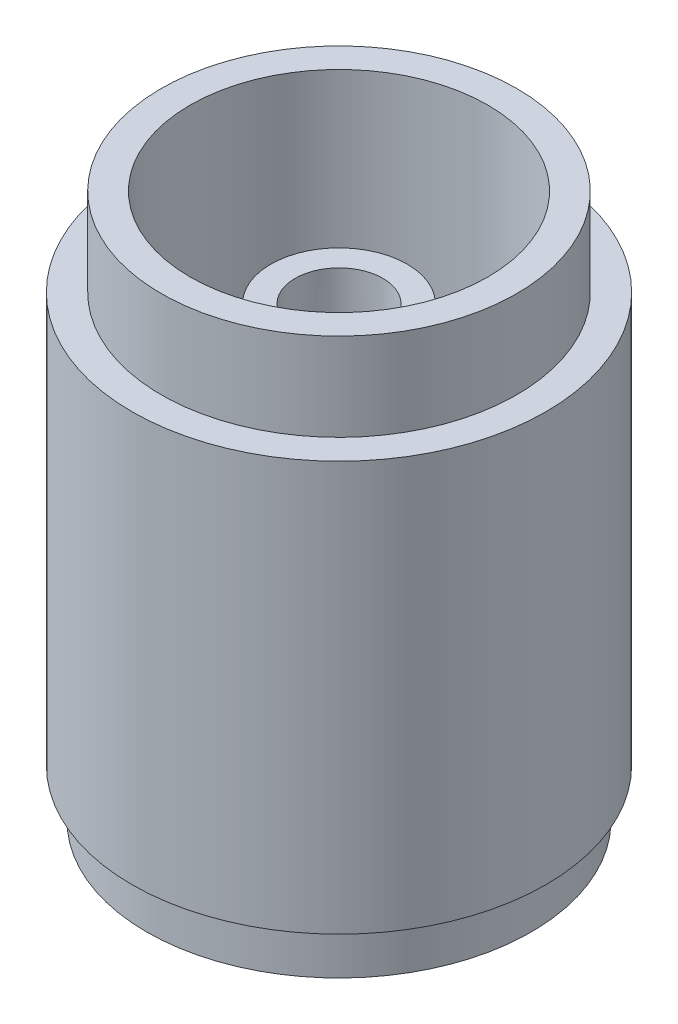
ISO-10303-21;
HEADER;
FILE_DESCRIPTION(('STEP AP214'),'2;1');
FILE_NAME('part.step','',(''),(''),'','','');
FILE_SCHEMA(('AUTOMOTIVE_DESIGN { 1 0 10303 214 1 1 1 1 }'));
ENDSEC;
DATA;
#1=APPLICATION_CONTEXT('core data for automotive mechanical design processes');
#2=APPLICATION_PROTOCOL_DEFINITION('international standard','automotive_design',2000,#1);
#3=PRODUCT_CONTEXT('',#1,'mechanical');
#4=PRODUCT('Part','Part','',(#3));
#5=PRODUCT_RELATED_PRODUCT_CATEGORY('part','',(#4));
#6=PRODUCT_DEFINITION_FORMATION('','',#4);
#7=PRODUCT_DEFINITION_CONTEXT('part definition',#1,'design');
#8=PRODUCT_DEFINITION('design','',#6,#7);
#9=PRODUCT_DEFINITION_SHAPE('','',#8);
#10=(LENGTH_UNIT() NAMED_UNIT(*) SI_UNIT(.MILLI.,.METRE.));
#11=(NAMED_UNIT(*) PLANE_ANGLE_UNIT() SI_UNIT($,.RADIAN.));
#12=(NAMED_UNIT(*) SI_UNIT($,.STERADIAN.) SOLID_ANGLE_UNIT());
#13=UNCERTAINTY_MEASURE_WITH_UNIT(LENGTH_MEASURE(1.E-05),#10,'distance_accuracy_value','');
#14=(GEOMETRIC_REPRESENTATION_CONTEXT(3) GLOBAL_UNCERTAINTY_ASSIGNED_CONTEXT((#13)) GLOBAL_UNIT_ASSIGNED_CONTEXT((#10,
#11,#12)) REPRESENTATION_CONTEXT('',''));
#15=CARTESIAN_POINT('',(0.,0.,0.));
#16=DIRECTION('',(0.,0.,1.));
#17=DIRECTION('',(1.,0.,0.));
#18=AXIS2_PLACEMENT_3D('',#15,#16,#17);
#19=CARTESIAN_POINT('',(0.,0.,0.));
#20=DIRECTION('',(0.,-1.,0.));
#21=DIRECTION('',(0.,0.,-1.));
#22=AXIS2_PLACEMENT_3D('',#19,#20,#21);
#23=CYLINDRICAL_SURFACE('',#22,30.5682647065031);
#24=CARTESIAN_POINT('',(0.,62.8381113163865,0.));
#25=DIRECTION('',(0.,1.,0.));
#26=DIRECTION('',(0.,0.,1.));
#27=AXIS2_PLACEMENT_3D('',#24,#25,#26);
#28=CIRCLE('',#27,30.5682647065031);
#29=CARTESIAN_POINT('',(0.,62.8381113163865,30.5682647065031));
#30=VERTEX_POINT('',#29);
#31=EDGE_CURVE('E64',#30,#30,#28,.T.);
#32=ORIENTED_EDGE('',*,*,#31,.F.);
#33=EDGE_LOOP('',(#32));
#34=FACE_BOUND('',#33,.T.);
#35=CARTESIAN_POINT('',(0.,110.,0.));
#36=DIRECTION('',(0.,-1.,0.));
#37=DIRECTION('',(0.,0.,-1.));
#38=AXIS2_PLACEMENT_3D('',#35,#36,#37);
#39=CIRCLE('',#38,30.5682647065031);
#40=CARTESIAN_POINT('',(0.,110.,-30.5682647065031));
#41=VERTEX_POINT('',#40);
#42=EDGE_CURVE('E124',#41,#41,#39,.T.);
#43=ORIENTED_EDGE('',*,*,#42,.F.);
#44=EDGE_LOOP('',(#43));
#45=FACE_BOUND('',#44,.T.);
#46=ADVANCED_FACE('F50',(#34,#45),#23,.F.);
#47=CARTESIAN_POINT('',(0.,28.7893183093686,0.));
#48=DIRECTION('',(0.,-1.,0.));
#49=DIRECTION('',(0.,0.,-1.));
#50=AXIS2_PLACEMENT_3D('',#47,#48,#49);
#51=CIRCLE('',#50,30.5682647065031);
#52=CARTESIAN_POINT('',(0.,28.7893183093686,-30.5682647065031));
#53=VERTEX_POINT('',#52);
#54=EDGE_CURVE('E121',#53,#53,#51,.T.);
#55=ORIENTED_EDGE('',*,*,#54,.T.);
#56=EDGE_LOOP('',(#55));
#57=FACE_BOUND('',#56,.T.);
#58=CARTESIAN_POINT('',(0.,44.6147886961922,0.));
#59=DIRECTION('',(0.,1.,0.));
#60=DIRECTION('',(0.,0.,1.));
#61=AXIS2_PLACEMENT_3D('',#58,#59,#60);
#62=CIRCLE('',#61,30.5682647065031);
#63=CARTESIAN_POINT('',(0.,44.6147886961922,30.5682647065031));
#64=VERTEX_POINT('',#63);
#65=EDGE_CURVE('E74',#64,#64,#62,.T.);
#66=ORIENTED_EDGE('',*,*,#65,.T.);
#67=EDGE_LOOP('',(#66));
#68=FACE_BOUND('',#67,.T.);
#69=ADVANCED_FACE('F208',(#57,#68),#23,.F.);
#70=CARTESIAN_POINT('',(0.,0.,0.));
#71=DIRECTION('',(0.,-1.,0.));
#72=DIRECTION('',(0.,0.,-1.));
#73=AXIS2_PLACEMENT_3D('',#70,#71,#72);
#74=CYLINDRICAL_SURFACE('',#73,30.5682647065031);
#75=CARTESIAN_POINT('',(0.,-2.,0.));
#76=DIRECTION('',(0.,-1.,0.));
#77=DIRECTION('',(0.,0.,-1.));
#78=AXIS2_PLACEMENT_3D('',#75,#76,#77);
#79=CIRCLE('',#78,30.5682647065031);
#80=CARTESIAN_POINT('',(0.,-2.,-30.5682647065031));
#81=VERTEX_POINT('',#80);
#82=EDGE_CURVE('E145',#81,#81,#79,.T.);
#83=ORIENTED_EDGE('',*,*,#82,.T.);
#84=EDGE_LOOP('',(#83));
#85=FACE_BOUND('',#84,.T.);
#86=CARTESIAN_POINT('',(0.,7.91382459911701,0.));
#87=DIRECTION('',(0.,-1.,0.));
#88=DIRECTION('',(0.,0.,-1.));
#89=AXIS2_PLACEMENT_3D('',#86,#87,#88);
#90=CIRCLE('',#89,30.5682647065031);
#91=CARTESIAN_POINT('',(0.,7.91382459911701,-30.5682647065031));
#92=VERTEX_POINT('',#91);
#93=EDGE_CURVE('E112',#92,#92,#90,.T.);
#94=ORIENTED_EDGE('',*,*,#93,.F.);
#95=EDGE_LOOP('',(#94));
#96=FACE_BOUND('',#95,.T.);
#97=ADVANCED_FACE('F52',(#85,#96),#74,.F.);
#98=CARTESIAN_POINT('',(0.,-2.,0.));
#99=DIRECTION('',(0.,-1.,0.));
#100=DIRECTION('',(0.,0.,-1.));
#101=AXIS2_PLACEMENT_3D('',#98,#99,#100);
#102=PLANE('',#101);
#103=CARTESIAN_POINT('',(0.,-2.,0.));
#104=DIRECTION('',(0.,-1.,0.));
#105=DIRECTION('',(0.,0.,-1.));
#106=AXIS2_PLACEMENT_3D('',#103,#104,#105);
#107=CIRCLE('',#106,39.4832277809891);
#108=CARTESIAN_POINT('',(0.,-2.,-39.4832277809891));
#109=VERTEX_POINT('',#108);
#110=EDGE_CURVE('E142',#109,#109,#107,.T.);
#111=ORIENTED_EDGE('',*,*,#110,.T.);
#112=EDGE_LOOP('',(#111));
#113=FACE_BOUND('',#112,.T.);
#114=ORIENTED_EDGE('',*,*,#82,.F.);
#115=EDGE_LOOP('',(#114));
#116=FACE_BOUND('',#115,.T.);
#117=ADVANCED_FACE('F280',(#113,#116),#102,.T.);
#118=CARTESIAN_POINT('',(0.,0.,0.));
#119=DIRECTION('',(0.,-1.,0.));
#120=DIRECTION('',(0.,0.,-1.));
#121=AXIS2_PLACEMENT_3D('',#118,#119,#120);
#122=CYLINDRICAL_SURFACE('',#121,39.4832277809891);
#123=CARTESIAN_POINT('',(0.,7.91382459911701,0.));
#124=DIRECTION('',(0.,-1.,0.));
#125=DIRECTION('',(0.,0.,-1.));
#126=AXIS2_PLACEMENT_3D('',#123,#124,#125);
#127=CIRCLE('',#126,39.4832277809891);
#128=CARTESIAN_POINT('',(0.,7.91382459911701,-39.4832277809891));
#129=VERTEX_POINT('',#128);
#130=EDGE_CURVE('E139',#129,#129,#127,.T.);
#131=ORIENTED_EDGE('',*,*,#130,.T.);
#132=EDGE_LOOP('',(#131));
#133=FACE_BOUND('',#132,.T.);
#134=ORIENTED_EDGE('',*,*,#110,.F.);
#135=EDGE_LOOP('',(#134));
#136=FACE_BOUND('',#135,.T.);
#137=ADVANCED_FACE('F286',(#133,#136),#122,.T.);
#138=CARTESIAN_POINT('',(0.,7.91382459911701,0.));
#139=DIRECTION('',(0.,-1.,0.));
#140=DIRECTION('',(0.,0.,-1.));
#141=AXIS2_PLACEMENT_3D('',#138,#139,#140);
#142=PLANE('',#141);
#143=CARTESIAN_POINT('',(0.,7.91382459911701,0.));
#144=DIRECTION('',(0.,-1.,0.));
#145=DIRECTION('',(0.,0.,-1.));
#146=AXIS2_PLACEMENT_3D('',#143,#144,#145);
#147=CIRCLE('',#146,42.4832277809891);
#148=CARTESIAN_POINT('',(0.,7.91382459911701,-42.4832277809891));
#149=VERTEX_POINT('',#148);
#150=EDGE_CURVE('E136',#149,#149,#147,.T.);
#151=ORIENTED_EDGE('',*,*,#150,.T.);
#152=EDGE_LOOP('',(#151));
#153=FACE_BOUND('',#152,.T.);
#154=ORIENTED_EDGE('',*,*,#130,.F.);
#155=EDGE_LOOP('',(#154));
#156=FACE_BOUND('',#155,.T.);
#157=ADVANCED_FACE('F293',(#153,#156),#142,.T.);
#158=CARTESIAN_POINT('',(0.,0.,0.));
#159=DIRECTION('',(0.,-1.,0.));
#160=DIRECTION('',(0.,0.,-1.));
#161=AXIS2_PLACEMENT_3D('',#158,#159,#160);
#162=CYLINDRICAL_SURFACE('',#161,42.4832277809891);
#163=CARTESIAN_POINT('',(0.,92.,0.));
#164=DIRECTION('',(0.,-1.,0.));
#165=DIRECTION('',(0.,0.,-1.));
#166=AXIS2_PLACEMENT_3D('',#163,#164,#165);
#167=CIRCLE('',#166,42.4832277809891);
#168=CARTESIAN_POINT('',(0.,92.,-42.4832277809891));
#169=VERTEX_POINT('',#168);
#170=EDGE_CURVE('E133',#169,#169,#167,.T.);
#171=ORIENTED_EDGE('',*,*,#170,.T.);
#172=EDGE_LOOP('',(#171));
#173=FACE_BOUND('',#172,.T.);
#174=ORIENTED_EDGE('',*,*,#150,.F.);
#175=EDGE_LOOP('',(#174));
#176=FACE_BOUND('',#175,.T.);
#177=ADVANCED_FACE('F299',(#173,#176),#162,.T.);
#178=CARTESIAN_POINT('',(0.,92.,0.));
#179=DIRECTION('',(0.,1.,0.));
#180=DIRECTION('',(0.,0.,1.));
#181=AXIS2_PLACEMENT_3D('',#178,#179,#180);
#182=PLANE('',#181);
#183=CARTESIAN_POINT('',(0.,92.,0.));
#184=DIRECTION('',(0.,-1.,0.));
#185=DIRECTION('',(0.,0.,-1.));
#186=AXIS2_PLACEMENT_3D('',#183,#184,#185);
#187=CIRCLE('',#186,36.4832277809891);
#188=CARTESIAN_POINT('',(0.,92.,-36.4832277809891));
#189=VERTEX_POINT('',#188);
#190=EDGE_CURVE('E130',#189,#189,#187,.T.);
#191=ORIENTED_EDGE('',*,*,#190,.T.);
#192=EDGE_LOOP('',(#191));
#193=FACE_BOUND('',#192,.T.);
#194=ORIENTED_EDGE('',*,*,#170,.F.);
#195=EDGE_LOOP('',(#194));
#196=FACE_BOUND('',#195,.T.);
#197=ADVANCED_FACE('F303',(#193,#196),#182,.T.);
#198=CARTESIAN_POINT('',(0.,0.,0.));
#199=DIRECTION('',(0.,-1.,0.));
#200=DIRECTION('',(0.,0.,-1.));
#201=AXIS2_PLACEMENT_3D('',#198,#199,#200);
#202=CYLINDRICAL_SURFACE('',#201,36.4832277809891);
#203=CARTESIAN_POINT('',(0.,110.,0.));
#204=DIRECTION('',(0.,-1.,0.));
#205=DIRECTION('',(0.,0.,-1.));
#206=AXIS2_PLACEMENT_3D('',#203,#204,#205);
#207=CIRCLE('',#206,36.4832277809891);
#208=CARTESIAN_POINT('',(0.,110.,-36.4832277809891));
#209=VERTEX_POINT('',#208);
#210=EDGE_CURVE('E127',#209,#209,#207,.T.);
#211=ORIENTED_EDGE('',*,*,#210,.T.);
#212=EDGE_LOOP('',(#211));
#213=FACE_BOUND('',#212,.T.);
#214=ORIENTED_EDGE('',*,*,#190,.F.);
#215=EDGE_LOOP('',(#214));
#216=FACE_BOUND('',#215,.T.);
#217=ADVANCED_FACE('F269',(#213,#216),#202,.T.);
#218=CARTESIAN_POINT('',(0.,110.,0.));
#219=DIRECTION('',(0.,1.,0.));
#220=DIRECTION('',(0.,0.,1.));
#221=AXIS2_PLACEMENT_3D('',#218,#219,#220);
#222=PLANE('',#221);
#223=ORIENTED_EDGE('',*,*,#42,.T.);
#224=EDGE_LOOP('',(#223));
#225=FACE_BOUND('',#224,.T.);
#226=ORIENTED_EDGE('',*,*,#210,.F.);
#227=EDGE_LOOP('',(#226));
#228=FACE_BOUND('',#227,.T.);
#229=ADVANCED_FACE('F263',(#225,#228),#222,.T.);
#230=CARTESIAN_POINT('',(0.,21.0508126923882,0.));
#231=DIRECTION('',(0.,1.,0.));
#232=DIRECTION('',(0.,0.,1.));
#233=AXIS2_PLACEMENT_3D('',#230,#231,#232);
#234=CONICAL_SURFACE('',#233,17.5682647065031,1.03386227535441);
#235=ORIENTED_EDGE('',*,*,#54,.F.);
#236=EDGE_LOOP('',(#235));
#237=FACE_BOUND('',#236,.T.);
#238=CARTESIAN_POINT('',(0.,21.0508126923882,0.));
#239=DIRECTION('',(0.,-1.,0.));
#240=DIRECTION('',(0.,0.,-1.));
#241=AXIS2_PLACEMENT_3D('',#238,#239,#240);
#242=CIRCLE('',#241,17.5682647065031);
#243=CARTESIAN_POINT('',(0.,21.0508126923882,-17.5682647065031));
#244=VERTEX_POINT('',#243);
#245=EDGE_CURVE('E118',#244,#244,#242,.T.);
#246=ORIENTED_EDGE('',*,*,#245,.T.);
#247=EDGE_LOOP('',(#246));
#248=FACE_BOUND('',#247,.T.);
#249=ADVANCED_FACE('F260',(#237,#248),#234,.F.);
#250=CARTESIAN_POINT('',(0.,0.,0.));
#251=DIRECTION('',(0.,-1.,0.));
#252=DIRECTION('',(0.,0.,-1.));
#253=AXIS2_PLACEMENT_3D('',#250,#251,#252);
#254=CYLINDRICAL_SURFACE('',#253,17.5682647065031);
#255=ORIENTED_EDGE('',*,*,#245,.F.);
#256=EDGE_LOOP('',(#255));
#257=FACE_BOUND('',#256,.T.);
#258=CARTESIAN_POINT('',(0.,7.91382459911701,0.));
#259=DIRECTION('',(0.,-1.,0.));
#260=DIRECTION('',(0.,0.,-1.));
#261=AXIS2_PLACEMENT_3D('',#258,#259,#260);
#262=CIRCLE('',#261,17.5682647065031);
#263=CARTESIAN_POINT('',(0.,7.91382459911701,-17.5682647065031));
#264=VERTEX_POINT('',#263);
#265=EDGE_CURVE('E115',#264,#264,#262,.T.);
#266=ORIENTED_EDGE('',*,*,#265,.T.);
#267=EDGE_LOOP('',(#266));
#268=FACE_BOUND('',#267,.T.);
#269=ADVANCED_FACE('F257',(#257,#268),#254,.F.);
#270=CARTESIAN_POINT('',(0.,7.91382459911701,0.));
#271=DIRECTION('',(0.,1.,0.));
#272=DIRECTION('',(0.,0.,1.));
#273=AXIS2_PLACEMENT_3D('',#270,#271,#272);
#274=PLANE('',#273);
#275=ORIENTED_EDGE('',*,*,#265,.F.);
#276=EDGE_LOOP('',(#275));
#277=FACE_BOUND('',#276,.T.);
#278=ORIENTED_EDGE('',*,*,#93,.T.);
#279=EDGE_LOOP('',(#278));
#280=FACE_BOUND('',#279,.T.);
#281=ADVANCED_FACE('F253',(#277,#280),#274,.F.);
#282=CARTESIAN_POINT('',(0.,44.6147886961922,0.));
#283=DIRECTION('',(0.,1.,0.));
#284=DIRECTION('',(0.,0.,1.));
#285=AXIS2_PLACEMENT_3D('',#282,#283,#284);
#286=PLANE('',#285);
#287=CARTESIAN_POINT('',(0.,44.6147886961922,0.));
#288=DIRECTION('',(0.,1.,0.));
#289=DIRECTION('',(0.,0.,1.));
#290=AXIS2_PLACEMENT_3D('',#287,#288,#289);
#291=CIRCLE('',#290,14.1436530836696);
#292=CARTESIAN_POINT('',(0.,44.6147886961922,14.1436530836696));
#293=VERTEX_POINT('',#292);
#294=EDGE_CURVE('E59',#293,#293,#291,.F.);
#295=ORIENTED_EDGE('',*,*,#294,.F.);
#296=EDGE_LOOP('',(#295));
#297=FACE_BOUND('',#296,.T.);
#298=ORIENTED_EDGE('',*,*,#65,.F.);
#299=EDGE_LOOP('',(#298));
#300=FACE_BOUND('',#299,.T.);
#301=ADVANCED_FACE('F256',(#297,#300),#286,.F.);
#302=CARTESIAN_POINT('',(0.,62.8381113163865,0.));
#303=DIRECTION('',(0.,1.,0.));
#304=DIRECTION('',(0.,0.,1.));
#305=AXIS2_PLACEMENT_3D('',#302,#303,#304);
#306=PLANE('',#305);
#307=CARTESIAN_POINT('',(0.,62.8381113163865,0.));
#308=DIRECTION('',(0.,1.,0.));
#309=DIRECTION('',(0.,0.,1.));
#310=AXIS2_PLACEMENT_3D('',#307,#308,#309);
#311=CIRCLE('',#310,14.0859726980574);
#312=CARTESIAN_POINT('',(0.,62.8381113163865,14.0859726980574));
#313=VERTEX_POINT('',#312);
#314=EDGE_CURVE('E156',#313,#313,#311,.F.);
#315=ORIENTED_EDGE('',*,*,#314,.T.);
#316=EDGE_LOOP('',(#315));
#317=FACE_BOUND('',#316,.T.);
#318=ORIENTED_EDGE('',*,*,#31,.T.);
#319=EDGE_LOOP('',(#318));
#320=FACE_BOUND('',#319,.T.);
#321=ADVANCED_FACE('F202',(#317,#320),#306,.T.);
#322=CARTESIAN_POINT('',(0.,27.055868251851,0.));
#323=DIRECTION('',(0.,-1.,0.));
#324=DIRECTION('',(0.,0.,-1.));
#325=AXIS2_PLACEMENT_3D('',#322,#323,#324);
#326=CONICAL_SURFACE('',#325,9.19920546015496,0.00316518530635682);
#327=CARTESIAN_POINT('',(0.,62.8381113163865,0.));
#328=DIRECTION('',(0.,1.,0.));
#329=DIRECTION('',(0.,0.,1.));
#330=AXIS2_PLACEMENT_3D('',#327,#328,#329);
#331=CIRCLE('',#330,9.08594765195776);
#332=CARTESIAN_POINT('',(0.,62.8381113163865,9.08594765195776));
#333=VERTEX_POINT('',#332);
#334=EDGE_CURVE('E54',#333,#333,#331,.T.);
#335=ORIENTED_EDGE('',*,*,#334,.F.);
#336=EDGE_LOOP('',(#335));
#337=FACE_BOUND('',#336,.T.);
#338=CARTESIAN_POINT('',(0.,89.9841740998933,0.));
#339=DIRECTION('',(0.,-1.,0.));
#340=DIRECTION('',(0.,0.,-1.));
#341=AXIS2_PLACEMENT_3D('',#338,#339,#340);
#342=CIRCLE('',#341,9.00002504597415);
#343=CARTESIAN_POINT('',(0.,89.9841740998933,-9.00002504597415));
#344=VERTEX_POINT('',#343);
#345=EDGE_CURVE('E158',#344,#344,#342,.T.);
#346=ORIENTED_EDGE('',*,*,#345,.F.);
#347=EDGE_LOOP('',(#346));
#348=FACE_BOUND('',#347,.T.);
#349=ADVANCED_FACE('F192',(#337,#348),#326,.F.);
#350=CARTESIAN_POINT('',(0.,89.9841740998933,0.));
#351=DIRECTION('',(0.,1.,0.));
#352=DIRECTION('',(0.,0.,1.));
#353=AXIS2_PLACEMENT_3D('',#350,#351,#352);
#354=CONICAL_SURFACE('',#353,9.00002504597415,1.56763114148854);
#355=CARTESIAN_POINT('',(0.,90.,0.));
#356=DIRECTION('',(0.,-1.,0.));
#357=DIRECTION('',(0.,0.,-1.));
#358=AXIS2_PLACEMENT_3D('',#355,#356,#357);
#359=CIRCLE('',#358,14.);
#360=CARTESIAN_POINT('',(0.,90.,-14.));
#361=VERTEX_POINT('',#360);
#362=EDGE_CURVE('E184',#361,#361,#359,.T.);
#363=ORIENTED_EDGE('',*,*,#362,.F.);
#364=EDGE_LOOP('',(#363));
#365=FACE_BOUND('',#364,.T.);
#366=ORIENTED_EDGE('',*,*,#345,.T.);
#367=EDGE_LOOP('',(#366));
#368=FACE_BOUND('',#367,.T.);
#369=ADVANCED_FACE('F190',(#365,#368),#354,.F.);
#370=CARTESIAN_POINT('',(0.,90.,0.));
#371=DIRECTION('',(0.,-1.,0.));
#372=DIRECTION('',(0.,0.,-1.));
#373=AXIS2_PLACEMENT_3D('',#370,#371,#372);
#374=CONICAL_SURFACE('',#373,14.,0.00316518530635683);
#375=ORIENTED_EDGE('',*,*,#314,.F.);
#376=EDGE_LOOP('',(#375));
#377=FACE_BOUND('',#376,.T.);
#378=ORIENTED_EDGE('',*,*,#362,.T.);
#379=EDGE_LOOP('',(#378));
#380=FACE_BOUND('',#379,.T.);
#381=ADVANCED_FACE('F188',(#377,#380),#374,.T.);
#382=ORIENTED_EDGE('',*,*,#334,.T.);
#383=EDGE_LOOP('',(#382));
#384=FACE_BOUND('',#383,.T.);
#385=ADVANCED_FACE('F198',(#384),#306,.T.);
#386=CARTESIAN_POINT('',(0.,27.055868251851,0.));
#387=DIRECTION('',(0.,-1.,0.));
#388=DIRECTION('',(0.,0.,-1.));
#389=AXIS2_PLACEMENT_3D('',#386,#387,#388);
#390=CIRCLE('',#389,9.19920546015496);
#391=CARTESIAN_POINT('',(0.,27.055868251851,9.19920546015497));
#392=VERTEX_POINT('',#391);
#393=EDGE_CURVE('E163',#392,#392,#390,.T.);
#394=ORIENTED_EDGE('',*,*,#393,.T.);
#395=EDGE_LOOP('',(#394));
#396=FACE_BOUND('',#395,.T.);
#397=CARTESIAN_POINT('',(0.,44.6147886961922,0.));
#398=DIRECTION('',(0.,1.,0.));
#399=DIRECTION('',(0.,0.,1.));
#400=AXIS2_PLACEMENT_3D('',#397,#398,#399);
#401=CIRCLE('',#400,9.14362803757001);
#402=CARTESIAN_POINT('',(0.,44.6147886961922,9.14362803757001));
#403=VERTEX_POINT('',#402);
#404=EDGE_CURVE('E10',#403,#403,#401,.T.);
#405=ORIENTED_EDGE('',*,*,#404,.T.);
#406=EDGE_LOOP('',(#405));
#407=FACE_BOUND('',#406,.T.);
#408=ADVANCED_FACE('F205',(#396,#407),#326,.F.);
#409=CARTESIAN_POINT('',(0.,24.7396371852266,0.));
#410=DIRECTION('',(0.,-1.,0.));
#411=DIRECTION('',(0.,0.,-1.));
#412=AXIS2_PLACEMENT_3D('',#409,#410,#411);
#413=CIRCLE('',#412,14.2065618312755);
#414=CARTESIAN_POINT('',(0.,24.7396371852266,-14.2065618312755));
#415=VERTEX_POINT('',#414);
#416=EDGE_CURVE('E181',#415,#415,#413,.T.);
#417=ORIENTED_EDGE('',*,*,#416,.F.);
#418=EDGE_LOOP('',(#417));
#419=FACE_BOUND('',#418,.T.);
#420=ORIENTED_EDGE('',*,*,#294,.T.);
#421=EDGE_LOOP('',(#420));
#422=FACE_BOUND('',#421,.T.);
#423=ADVANCED_FACE('F201',(#419,#422),#374,.T.);
#424=CARTESIAN_POINT('',(0.,21.8224413834987,0.));
#425=DIRECTION('',(0.,1.,0.));
#426=DIRECTION('',(0.,0.,1.));
#427=AXIS2_PLACEMENT_3D('',#424,#425,#426);
#428=CONICAL_SURFACE('',#427,3.,0.869673686636733);
#429=CARTESIAN_POINT('',(0.,21.8224413834987,0.));
#430=DIRECTION('',(0.,-1.,0.));
#431=DIRECTION('',(0.,0.,-1.));
#432=AXIS2_PLACEMENT_3D('',#429,#430,#431);
#433=CIRCLE('',#432,3.);
#434=CARTESIAN_POINT('',(0.,21.8224413834987,3.));
#435=VERTEX_POINT('',#434);
#436=EDGE_CURVE('E167',#435,#435,#433,.T.);
#437=CARTESIAN_POINT('',(0.,27.055868251851,9.19920546015497));
#438=CARTESIAN_POINT('',(0.,27.001353388639,9.13463040327835));
#439=CARTESIAN_POINT('',(0.,26.946838525427,9.07005534640174));
#440=CARTESIAN_POINT('',(0.,26.837808799003,8.94090523264851));
#441=CARTESIAN_POINT('',(0.,26.783293935791,8.8763301757719));
#442=CARTESIAN_POINT('',(0.,26.674264209367,8.74718006201867));
#443=CARTESIAN_POINT('',(0.,26.619749346155,8.68260500514205));
#444=CARTESIAN_POINT('',(0.,26.510719619731,8.55345489138882));
#445=CARTESIAN_POINT('',(0.,26.456204756519,8.48887983451221));
#446=CARTESIAN_POINT('',(0.,26.347175030095,8.35972972075898));
#447=CARTESIAN_POINT('',(0.,26.292660166883,8.29515466388237));
#448=CARTESIAN_POINT('',(0.,26.183630440459,8.16600455012914));
#449=CARTESIAN_POINT('',(0.,26.129115577247,8.10142949325252));
#450=CARTESIAN_POINT('',(0.,26.020085850823,7.9722793794993));
#451=CARTESIAN_POINT('',(0.,25.965570987611,7.90770432262268));
#452=CARTESIAN_POINT('',(0.,25.856541261187,7.77855420886945));
#453=CARTESIAN_POINT('',(0.,25.8020263979749,7.71397915199284));
#454=CARTESIAN_POINT('',(0.,25.6929966715509,7.58482903823961));
#455=CARTESIAN_POINT('',(0.,25.6384818083389,7.520253981363));
#456=CARTESIAN_POINT('',(0.,25.5294520819149,7.39110386760977));
#457=CARTESIAN_POINT('',(0.,25.4749372187029,7.32652881073315));
#458=CARTESIAN_POINT('',(0.,25.3659074922789,7.19737869697993));
#459=CARTESIAN_POINT('',(0.,25.3113926290669,7.13280364010331));
#460=CARTESIAN_POINT('',(0.,25.2023629026429,7.00365352635008));
#461=CARTESIAN_POINT('',(0.,25.1478480394309,6.93907846947347));
#462=CARTESIAN_POINT('',(0.,25.0388183130069,6.80992835572024));
#463=CARTESIAN_POINT('',(0.,24.9843034497949,6.74535329884363));
#464=CARTESIAN_POINT('',(0.,24.8752737233709,6.6162031850904));
#465=CARTESIAN_POINT('',(0.,24.8207588601589,6.55162812821378));
#466=CARTESIAN_POINT('',(0.,24.7117291337349,6.42247801446056));
#467=CARTESIAN_POINT('',(0.,24.6572142705229,6.35790295758394));
#468=CARTESIAN_POINT('',(0.,24.5481845440989,6.22875284383071));
#469=CARTESIAN_POINT('',(0.,24.4936696808869,6.1641777869541));
#470=CARTESIAN_POINT('',(0.,24.3846399544628,6.03502767320087));
#471=CARTESIAN_POINT('',(0.,24.3301250912508,5.97045261632426));
#472=CARTESIAN_POINT('',(0.,24.2210953648268,5.84130250257103));
#473=CARTESIAN_POINT('',(0.,24.1665805016148,5.77672744569441));
#474=CARTESIAN_POINT('',(0.,24.0575507751908,5.64757733194118));
#475=CARTESIAN_POINT('',(0.,24.0030359119788,5.58300227506457));
#476=CARTESIAN_POINT('',(0.,23.8940061855548,5.45385216131134));
#477=CARTESIAN_POINT('',(0.,23.8394913223428,5.38927710443473));
#478=CARTESIAN_POINT('',(0.,23.7304615959188,5.2601269906815));
#479=CARTESIAN_POINT('',(0.,23.6759467327068,5.19555193380489));
#480=CARTESIAN_POINT('',(0.,23.5669170062828,5.06640182005166));
#481=CARTESIAN_POINT('',(0.,23.5124021430708,5.00182676317504));
#482=CARTESIAN_POINT('',(0.,23.4033724166468,4.87267664942181));
#483=CARTESIAN_POINT('',(0.,23.3488575534348,4.8081015925452));
#484=CARTESIAN_POINT('',(0.,23.2398278270108,4.67895147879197));
#485=CARTESIAN_POINT('',(0.,23.1853129637988,4.61437642191536));
#486=CARTESIAN_POINT('',(0.,23.0762832373747,4.48522630816213));
#487=CARTESIAN_POINT('',(0.,23.0217683741627,4.42065125128552));
#488=CARTESIAN_POINT('',(0.,22.9127386477387,4.29150113753229));
#489=CARTESIAN_POINT('',(0.,22.8582237845267,4.22692608065567));
#490=CARTESIAN_POINT('',(0.,22.7491940581027,4.09777596690244));
#491=CARTESIAN_POINT('',(0.,22.6946791948907,4.03320091002583));
#492=CARTESIAN_POINT('',(0.,22.5856494684667,3.9040507962726));
#493=CARTESIAN_POINT('',(0.,22.5311346052547,3.83947573939599));
#494=CARTESIAN_POINT('',(0.,22.4221048788307,3.71032562564276));
#495=CARTESIAN_POINT('',(0.,22.3675900156187,3.64575056876614));
#496=CARTESIAN_POINT('',(0.,22.2585602891947,3.51660045501292));
#497=CARTESIAN_POINT('',(0.,22.2040454259827,3.4520253981363));
#498=CARTESIAN_POINT('',(0.,22.0950156995587,3.32287528438307));
#499=CARTESIAN_POINT('',(0.,22.0405008363467,3.25830022750646));
#500=CARTESIAN_POINT('',(0.,21.9314711099227,3.12915011375323));
#501=CARTESIAN_POINT('',(0.,21.8769562467107,3.06457505687662));
#502=CARTESIAN_POINT('',(0.,21.8224413834987,3.));
#503=B_SPLINE_CURVE_WITH_KNOTS('',3,(#437,#438,#439,#440,#441,#442,#443,#444,#445,#446,#447,
#448,#449,#450,#451,#452,#453,#454,#455,#456,#457,#458,#459,#460,#461,#462,#463,#464,#465,#466,
#467,#468,#469,#470,#471,#472,#473,#474,#475,#476,#477,#478,#479,#480,#481,#482,#483,#484,#485,
#486,#487,#488,#489,#490,#491,#492,#493,#494,#495,#496,#497,#498,#499,#500,#501,#502),
.UNSPECIFIED.,.F.,.F.,(4,2,2,2,2,2,2,2,2,2,2,2,2,2,2,2,2,2,2,2,2,2,2,2,2,2,2,2,2,2,2,2,4),(0.,
0.253527660295231,0.507055320590461,0.760582980885689,1.01411064118092,1.26763830147615,
1.52116596177138,1.77469362206661,2.02822128236184,2.28174894265706,2.5352766029523,
2.78880426324752,3.04233192354276,3.29585958383798,3.54938724413321,3.80291490442844,
4.05644256472367,4.3099702250189,4.56349788531413,4.81702554560936,5.07055320590459,
5.32408086619982,5.57760852649505,5.83113618679028,6.08466384708551,6.33819150738074,
6.59171916767597,6.8452468279712,7.09877448826642,7.35230214856165,7.60582980885688,
7.85935746915211,8.11288512944734),.UNSPECIFIED.);
#504=EDGE_CURVE('BSEAM531',#392,#435,#503,.T.);
#505=ORIENTED_EDGE('',*,*,#393,.F.);
#506=ORIENTED_EDGE('',*,*,#436,.T.);
#507=ORIENTED_EDGE('',*,*,#504,.T.);
#508=ORIENTED_EDGE('',*,*,#504,.F.);
#509=EDGE_LOOP('',(#505,#507,#506,#508));
#510=FACE_BOUND('',#509,.T.);
#511=ADVANCED_FACE('F531',(#510),#428,.F.);
#512=CARTESIAN_POINT('',(0.,0.,0.));
#513=DIRECTION('',(0.,-1.,0.));
#514=DIRECTION('',(0.,0.,-1.));
#515=AXIS2_PLACEMENT_3D('',#512,#513,#514);
#516=CYLINDRICAL_SURFACE('',#515,3.);
#517=ORIENTED_EDGE('',*,*,#436,.F.);
#518=EDGE_LOOP('',(#517));
#519=FACE_BOUND('',#518,.T.);
#520=CARTESIAN_POINT('',(0.,9.91382459911701,0.));
#521=DIRECTION('',(0.,-1.,0.));
#522=DIRECTION('',(0.,0.,-1.));
#523=AXIS2_PLACEMENT_3D('',#520,#521,#522);
#524=CIRCLE('',#523,3.);
#525=CARTESIAN_POINT('',(0.,9.91382459911701,-3.));
#526=VERTEX_POINT('',#525);
#527=EDGE_CURVE('E172',#526,#526,#524,.T.);
#528=ORIENTED_EDGE('',*,*,#527,.T.);
#529=EDGE_LOOP('',(#528));
#530=FACE_BOUND('',#529,.T.);
#531=ADVANCED_FACE('F551',(#519,#530),#516,.F.);
#532=CARTESIAN_POINT('',(-3.,9.91382459911701,0.));
#533=DIRECTION('',(0.,1.,0.));
#534=DIRECTION('',(0.,0.,1.));
#535=AXIS2_PLACEMENT_3D('',#532,#533,#534);
#536=PLANE('',#535);
#537=ORIENTED_EDGE('',*,*,#527,.F.);
#538=EDGE_LOOP('',(#537));
#539=FACE_BOUND('',#538,.T.);
#540=CARTESIAN_POINT('',(0.,9.91382459911701,0.));
#541=DIRECTION('',(0.,-1.,0.));
#542=DIRECTION('',(0.,0.,-1.));
#543=AXIS2_PLACEMENT_3D('',#540,#541,#542);
#544=CIRCLE('',#543,8.);
#545=CARTESIAN_POINT('',(0.,9.91382459911701,-8.));
#546=VERTEX_POINT('',#545);
#547=EDGE_CURVE('E175',#546,#546,#544,.T.);
#548=ORIENTED_EDGE('',*,*,#547,.T.);
#549=EDGE_LOOP('',(#548));
#550=FACE_BOUND('',#549,.T.);
#551=ADVANCED_FACE('F561',(#539,#550),#536,.F.);
#552=CARTESIAN_POINT('',(0.,0.,0.));
#553=DIRECTION('',(0.,-1.,0.));
#554=DIRECTION('',(0.,0.,-1.));
#555=AXIS2_PLACEMENT_3D('',#552,#553,#554);
#556=CYLINDRICAL_SURFACE('',#555,8.);
#557=ORIENTED_EDGE('',*,*,#547,.F.);
#558=EDGE_LOOP('',(#557));
#559=FACE_BOUND('',#558,.T.);
#560=CARTESIAN_POINT('',(0.,19.5,0.));
#561=DIRECTION('',(0.,-1.,0.));
#562=DIRECTION('',(0.,0.,-1.));
#563=AXIS2_PLACEMENT_3D('',#560,#561,#562);
#564=CIRCLE('',#563,8.);
#565=CARTESIAN_POINT('',(0.,19.5,-8.));
#566=VERTEX_POINT('',#565);
#567=EDGE_CURVE('E178',#566,#566,#564,.T.);
#568=ORIENTED_EDGE('',*,*,#567,.T.);
#569=EDGE_LOOP('',(#568));
#570=FACE_BOUND('',#569,.T.);
#571=ADVANCED_FACE('F571',(#559,#570),#556,.T.);
#572=CARTESIAN_POINT('',(0.,24.7396371852266,0.));
#573=DIRECTION('',(0.,1.,0.));
#574=DIRECTION('',(0.,0.,1.));
#575=AXIS2_PLACEMENT_3D('',#572,#573,#574);
#576=CONICAL_SURFACE('',#575,14.2065618312755,0.869673686636733);
#577=ORIENTED_EDGE('',*,*,#567,.F.);
#578=EDGE_LOOP('',(#577));
#579=FACE_BOUND('',#578,.T.);
#580=ORIENTED_EDGE('',*,*,#416,.T.);
#581=EDGE_LOOP('',(#580));
#582=FACE_BOUND('',#581,.T.);
#583=ADVANCED_FACE('F580',(#579,#582),#576,.T.);
#584=ORIENTED_EDGE('',*,*,#404,.F.);
#585=EDGE_LOOP('',(#584));
#586=FACE_BOUND('',#585,.T.);
#587=ADVANCED_FACE('F589',(#586),#286,.F.);
#588=CLOSED_SHELL('',(#46,#69,#97,#117,#137,#157,#177,#197,#217,#229,#249,#269,#281,#301,#321,
#349,#369,#381,#385,#408,#423,#511,#531,#551,#571,#583,#587));
#589=CARTESIAN_POINT('',(0.,50.3381320176845,0.));
#590=DIRECTION('',(0.,-1.,0.));
#591=DIRECTION('',(0.,0.,-1.));
#592=AXIS2_PLACEMENT_3D('',#589,#590,#591);
#593=CIRCLE('',#592,30.5682647065031);
#594=CARTESIAN_POINT('',(0.,50.3381320176845,-30.5682647065031));
#595=VERTEX_POINT('',#594);
#596=EDGE_CURVE('E150',#595,#595,#593,.T.);
#597=ORIENTED_EDGE('',*,*,#596,.T.);
#598=EDGE_LOOP('',(#597));
#599=FACE_BOUND('',#598,.T.);
#600=CARTESIAN_POINT('',(0.,57.0381113163865,0.));
#601=DIRECTION('',(0.,1.,0.));
#602=DIRECTION('',(0.,0.,1.));
#603=AXIS2_PLACEMENT_3D('',#600,#601,#602);
#604=CIRCLE('',#603,30.5682647065031);
#605=CARTESIAN_POINT('',(0.,57.0381113163865,30.5682647065031));
#606=VERTEX_POINT('',#605);
#607=EDGE_CURVE('E79',#606,#606,#604,.T.);
#608=ORIENTED_EDGE('',*,*,#607,.T.);
#609=EDGE_LOOP('',(#608));
#610=FACE_BOUND('',#609,.T.);
#611=ADVANCED_FACE('F211',(#599,#610),#23,.F.);
#612=CARTESIAN_POINT('',(0.,57.0381113163865,0.));
#613=DIRECTION('',(0.,1.,0.));
#614=DIRECTION('',(0.,0.,1.));
#615=AXIS2_PLACEMENT_3D('',#612,#613,#614);
#616=PLANE('',#615);
#617=CARTESIAN_POINT('',(0.,57.0381113163865,0.));
#618=DIRECTION('',(0.,-1.,0.));
#619=DIRECTION('',(0.,0.,-1.));
#620=AXIS2_PLACEMENT_3D('',#617,#618,#619);
#621=CIRCLE('',#620,21.0270142560212);
#622=CARTESIAN_POINT('',(0.,57.0381113163865,-21.0270142560212));
#623=VERTEX_POINT('',#622);
#624=EDGE_CURVE('E71',#623,#623,#621,.T.);
#625=ORIENTED_EDGE('',*,*,#624,.F.);
#626=EDGE_LOOP('',(#625));
#627=FACE_BOUND('',#626,.T.);
#628=ORIENTED_EDGE('',*,*,#607,.F.);
#629=EDGE_LOOP('',(#628));
#630=FACE_BOUND('',#629,.T.);
#631=ADVANCED_FACE('F222',(#627,#630),#616,.F.);
#632=CARTESIAN_POINT('',(0.,0.,0.));
#633=DIRECTION('',(0.,-1.,0.));
#634=DIRECTION('',(0.,0.,-1.));
#635=AXIS2_PLACEMENT_3D('',#632,#633,#634);
#636=CYLINDRICAL_SURFACE('',#635,21.0270142560212);
#637=ORIENTED_EDGE('',*,*,#624,.T.);
#638=EDGE_LOOP('',(#637));
#639=FACE_BOUND('',#638,.T.);
#640=CARTESIAN_POINT('',(0.,50.3381320176845,0.));
#641=DIRECTION('',(0.,-1.,0.));
#642=DIRECTION('',(0.,0.,-1.));
#643=AXIS2_PLACEMENT_3D('',#640,#641,#642);
#644=CIRCLE('',#643,21.0270142560212);
#645=CARTESIAN_POINT('',(0.,50.3381320176845,-21.0270142560212));
#646=VERTEX_POINT('',#645);
#647=EDGE_CURVE('E68',#646,#646,#644,.T.);
#648=ORIENTED_EDGE('',*,*,#647,.F.);
#649=EDGE_LOOP('',(#648));
#650=FACE_BOUND('',#649,.T.);
#651=ADVANCED_FACE('F230',(#639,#650),#636,.T.);
#652=CARTESIAN_POINT('',(0.,50.3381320176845,0.));
#653=DIRECTION('',(0.,-1.,0.));
#654=DIRECTION('',(0.,0.,-1.));
#655=AXIS2_PLACEMENT_3D('',#652,#653,#654);
#656=PLANE('',#655);
#657=ORIENTED_EDGE('',*,*,#647,.T.);
#658=EDGE_LOOP('',(#657));
#659=FACE_BOUND('',#658,.T.);
#660=ORIENTED_EDGE('',*,*,#596,.F.);
#661=EDGE_LOOP('',(#660));
#662=FACE_BOUND('',#661,.T.);
#663=ADVANCED_FACE('F648',(#659,#662),#656,.F.);
#664=CLOSED_SHELL('',(#611,#631,#651,#663));
#665=CARTESIAN_POINT('',(0.,0.,0.));
#666=DIRECTION('',(0.,-1.,0.));
#667=DIRECTION('',(0.,0.,-1.));
#668=AXIS2_PLACEMENT_3D('',#665,#666,#667);
#669=CYLINDRICAL_SURFACE('',#668,32.5682647065031);
#670=CARTESIAN_POINT('',(0.,0.,0.));
#671=DIRECTION('',(0.,-1.,0.));
#672=DIRECTION('',(0.,0.,-1.));
#673=AXIS2_PLACEMENT_3D('',#670,#671,#672);
#674=CIRCLE('',#673,32.5682647065031);
#675=CARTESIAN_POINT('',(0.,0.,-32.5682647065031));
#676=VERTEX_POINT('',#675);
#677=EDGE_CURVE('E109',#676,#676,#674,.T.);
#678=ORIENTED_EDGE('',*,*,#677,.F.);
#679=EDGE_LOOP('',(#678));
#680=FACE_BOUND('',#679,.T.);
#681=CARTESIAN_POINT('',(0.,9.91382459911701,0.));
#682=DIRECTION('',(0.,-1.,0.));
#683=DIRECTION('',(0.,0.,-1.));
#684=AXIS2_PLACEMENT_3D('',#681,#682,#683);
#685=CIRCLE('',#684,32.5682647065031);
#686=CARTESIAN_POINT('',(0.,9.91382459911701,-32.5682647065031));
#687=VERTEX_POINT('',#686);
#688=EDGE_CURVE('E75',#687,#687,#685,.T.);
#689=ORIENTED_EDGE('',*,*,#688,.T.);
#690=EDGE_LOOP('',(#689));
#691=FACE_BOUND('',#690,.T.);
#692=ADVANCED_FACE('F237',(#680,#691),#669,.T.);
#693=CARTESIAN_POINT('',(0.,0.,0.));
#694=DIRECTION('',(0.,-1.,0.));
#695=DIRECTION('',(0.,0.,-1.));
#696=AXIS2_PLACEMENT_3D('',#693,#694,#695);
#697=PLANE('',#696);
#698=CARTESIAN_POINT('',(0.,0.,0.));
#699=DIRECTION('',(0.,-1.,0.));
#700=DIRECTION('',(0.,0.,-1.));
#701=AXIS2_PLACEMENT_3D('',#698,#699,#700);
#702=CIRCLE('',#701,37.4832277809891);
#703=CARTESIAN_POINT('',(0.,0.,-37.4832277809891));
#704=VERTEX_POINT('',#703);
#705=EDGE_CURVE('E106',#704,#704,#702,.T.);
#706=ORIENTED_EDGE('',*,*,#705,.F.);
#707=EDGE_LOOP('',(#706));
#708=FACE_BOUND('',#707,.T.);
#709=ORIENTED_EDGE('',*,*,#677,.T.);
#710=EDGE_LOOP('',(#709));
#711=FACE_BOUND('',#710,.T.);
#712=ADVANCED_FACE('F239',(#708,#711),#697,.F.);
#713=CARTESIAN_POINT('',(0.,0.,0.));
#714=DIRECTION('',(0.,-1.,0.));
#715=DIRECTION('',(0.,0.,-1.));
#716=AXIS2_PLACEMENT_3D('',#713,#714,#715);
#717=CYLINDRICAL_SURFACE('',#716,37.4832277809891);
#718=CARTESIAN_POINT('',(0.,9.91382459911701,0.));
#719=DIRECTION('',(0.,-1.,0.));
#720=DIRECTION('',(0.,0.,-1.));
#721=AXIS2_PLACEMENT_3D('',#718,#719,#720);
#722=CIRCLE('',#721,37.4832277809891);
#723=CARTESIAN_POINT('',(0.,9.91382459911701,-37.4832277809891));
#724=VERTEX_POINT('',#723);
#725=EDGE_CURVE('E103',#724,#724,#722,.T.);
#726=ORIENTED_EDGE('',*,*,#725,.F.);
#727=EDGE_LOOP('',(#726));
#728=FACE_BOUND('',#727,.T.);
#729=ORIENTED_EDGE('',*,*,#705,.T.);
#730=EDGE_LOOP('',(#729));
#731=FACE_BOUND('',#730,.T.);
#732=ADVANCED_FACE('F246',(#728,#731),#717,.F.);
#733=CARTESIAN_POINT('',(0.,9.91382459911701,0.));
#734=DIRECTION('',(0.,-1.,0.));
#735=DIRECTION('',(0.,0.,-1.));
#736=AXIS2_PLACEMENT_3D('',#733,#734,#735);
#737=PLANE('',#736);
#738=CARTESIAN_POINT('',(0.,9.91382459911701,0.));
#739=DIRECTION('',(0.,-1.,0.));
#740=DIRECTION('',(0.,0.,-1.));
#741=AXIS2_PLACEMENT_3D('',#738,#739,#740);
#742=CIRCLE('',#741,40.4832277809891);
#743=CARTESIAN_POINT('',(0.,9.91382459911701,-40.4832277809891));
#744=VERTEX_POINT('',#743);
#745=EDGE_CURVE('E100',#744,#744,#742,.T.);
#746=ORIENTED_EDGE('',*,*,#745,.F.);
#747=EDGE_LOOP('',(#746));
#748=FACE_BOUND('',#747,.T.);
#749=ORIENTED_EDGE('',*,*,#725,.T.);
#750=EDGE_LOOP('',(#749));
#751=FACE_BOUND('',#750,.T.);
#752=ADVANCED_FACE('F401',(#748,#751),#737,.F.);
#753=CARTESIAN_POINT('',(0.,0.,0.));
#754=DIRECTION('',(0.,-1.,0.));
#755=DIRECTION('',(0.,0.,-1.));
#756=AXIS2_PLACEMENT_3D('',#753,#754,#755);
#757=CYLINDRICAL_SURFACE('',#756,40.4832277809891);
#758=CARTESIAN_POINT('',(0.,90.,0.));
#759=DIRECTION('',(0.,-1.,0.));
#760=DIRECTION('',(0.,0.,-1.));
#761=AXIS2_PLACEMENT_3D('',#758,#759,#760);
#762=CIRCLE('',#761,40.4832277809891);
#763=CARTESIAN_POINT('',(0.,90.,-40.4832277809891));
#764=VERTEX_POINT('',#763);
#765=EDGE_CURVE('E97',#764,#764,#762,.T.);
#766=ORIENTED_EDGE('',*,*,#765,.F.);
#767=EDGE_LOOP('',(#766));
#768=FACE_BOUND('',#767,.T.);
#769=ORIENTED_EDGE('',*,*,#745,.T.);
#770=EDGE_LOOP('',(#769));
#771=FACE_BOUND('',#770,.T.);
#772=ADVANCED_FACE('F410',(#768,#771),#757,.F.);
#773=CARTESIAN_POINT('',(0.,90.,0.));
#774=DIRECTION('',(0.,1.,0.));
#775=DIRECTION('',(0.,0.,1.));
#776=AXIS2_PLACEMENT_3D('',#773,#774,#775);
#777=PLANE('',#776);
#778=CARTESIAN_POINT('',(0.,90.,0.));
#779=DIRECTION('',(0.,-1.,0.));
#780=DIRECTION('',(0.,0.,-1.));
#781=AXIS2_PLACEMENT_3D('',#778,#779,#780);
#782=CIRCLE('',#781,34.4832277809891);
#783=CARTESIAN_POINT('',(0.,90.,-34.4832277809891));
#784=VERTEX_POINT('',#783);
#785=EDGE_CURVE('E94',#784,#784,#782,.T.);
#786=ORIENTED_EDGE('',*,*,#785,.F.);
#787=EDGE_LOOP('',(#786));
#788=FACE_BOUND('',#787,.T.);
#789=ORIENTED_EDGE('',*,*,#765,.T.);
#790=EDGE_LOOP('',(#789));
#791=FACE_BOUND('',#790,.T.);
#792=ADVANCED_FACE('F421',(#788,#791),#777,.F.);
#793=CARTESIAN_POINT('',(0.,0.,0.));
#794=DIRECTION('',(0.,-1.,0.));
#795=DIRECTION('',(0.,0.,-1.));
#796=AXIS2_PLACEMENT_3D('',#793,#794,#795);
#797=CYLINDRICAL_SURFACE('',#796,34.4832277809891);
#798=CARTESIAN_POINT('',(0.,108.,0.));
#799=DIRECTION('',(0.,-1.,0.));
#800=DIRECTION('',(0.,0.,-1.));
#801=AXIS2_PLACEMENT_3D('',#798,#799,#800);
#802=CIRCLE('',#801,34.4832277809891);
#803=CARTESIAN_POINT('',(0.,108.,-34.4832277809891));
#804=VERTEX_POINT('',#803);
#805=EDGE_CURVE('E91',#804,#804,#802,.T.);
#806=ORIENTED_EDGE('',*,*,#805,.F.);
#807=EDGE_LOOP('',(#806));
#808=FACE_BOUND('',#807,.T.);
#809=ORIENTED_EDGE('',*,*,#785,.T.);
#810=EDGE_LOOP('',(#809));
#811=FACE_BOUND('',#810,.T.);
#812=ADVANCED_FACE('F431',(#808,#811),#797,.F.);
#813=CARTESIAN_POINT('',(0.,108.,0.));
#814=DIRECTION('',(0.,1.,0.));
#815=DIRECTION('',(0.,0.,1.));
#816=AXIS2_PLACEMENT_3D('',#813,#814,#815);
#817=PLANE('',#816);
#818=CARTESIAN_POINT('',(0.,108.,0.));
#819=DIRECTION('',(0.,-1.,0.));
#820=DIRECTION('',(0.,0.,-1.));
#821=AXIS2_PLACEMENT_3D('',#818,#819,#820);
#822=CIRCLE('',#821,32.5682647065032);
#823=CARTESIAN_POINT('',(0.,108.,-32.5682647065032));
#824=VERTEX_POINT('',#823);
#825=EDGE_CURVE('E88',#824,#824,#822,.T.);
#826=ORIENTED_EDGE('',*,*,#825,.F.);
#827=EDGE_LOOP('',(#826));
#828=FACE_BOUND('',#827,.T.);
#829=ORIENTED_EDGE('',*,*,#805,.T.);
#830=EDGE_LOOP('',(#829));
#831=FACE_BOUND('',#830,.T.);
#832=ADVANCED_FACE('F442',(#828,#831),#817,.F.);
#833=CARTESIAN_POINT('',(0.,0.,0.));
#834=DIRECTION('',(0.,-1.,0.));
#835=DIRECTION('',(0.,0.,-1.));
#836=AXIS2_PLACEMENT_3D('',#833,#834,#835);
#837=CYLINDRICAL_SURFACE('',#836,32.5682647065031);
#838=CARTESIAN_POINT('',(0.,27.6523302160974,0.));
#839=DIRECTION('',(0.,-1.,0.));
#840=DIRECTION('',(0.,0.,-1.));
#841=AXIS2_PLACEMENT_3D('',#838,#839,#840);
#842=CIRCLE('',#841,32.5682647065031);
#843=CARTESIAN_POINT('',(0.,27.6523302160974,-32.5682647065031));
#844=VERTEX_POINT('',#843);
#845=EDGE_CURVE('E85',#844,#844,#842,.T.);
#846=ORIENTED_EDGE('',*,*,#845,.F.);
#847=EDGE_LOOP('',(#846));
#848=FACE_BOUND('',#847,.T.);
#849=ORIENTED_EDGE('',*,*,#825,.T.);
#850=EDGE_LOOP('',(#849));
#851=FACE_BOUND('',#850,.T.);
#852=ADVANCED_FACE('F452',(#848,#851),#837,.T.);
#853=CARTESIAN_POINT('',(0.,19.913824599117,0.));
#854=DIRECTION('',(0.,1.,0.));
#855=DIRECTION('',(0.,0.,1.));
#856=AXIS2_PLACEMENT_3D('',#853,#854,#855);
#857=CONICAL_SURFACE('',#856,19.5682647065031,1.03386227535441);
#858=ORIENTED_EDGE('',*,*,#845,.T.);
#859=EDGE_LOOP('',(#858));
#860=FACE_BOUND('',#859,.T.);
#861=CARTESIAN_POINT('',(0.,19.913824599117,0.));
#862=DIRECTION('',(0.,-1.,0.));
#863=DIRECTION('',(0.,0.,-1.));
#864=AXIS2_PLACEMENT_3D('',#861,#862,#863);
#865=CIRCLE('',#864,19.5682647065031);
#866=CARTESIAN_POINT('',(0.,19.913824599117,-19.5682647065031));
#867=VERTEX_POINT('',#866);
#868=EDGE_CURVE('E82',#867,#867,#865,.T.);
#869=ORIENTED_EDGE('',*,*,#868,.F.);
#870=EDGE_LOOP('',(#869));
#871=FACE_BOUND('',#870,.T.);
#872=ADVANCED_FACE('F463',(#860,#871),#857,.T.);
#873=CARTESIAN_POINT('',(0.,0.,0.));
#874=DIRECTION('',(0.,-1.,0.));
#875=DIRECTION('',(0.,0.,-1.));
#876=AXIS2_PLACEMENT_3D('',#873,#874,#875);
#877=CYLINDRICAL_SURFACE('',#876,19.5682647065031);
#878=ORIENTED_EDGE('',*,*,#868,.T.);
#879=EDGE_LOOP('',(#878));
#880=FACE_BOUND('',#879,.T.);
#881=CARTESIAN_POINT('',(0.,9.91382459911701,0.));
#882=DIRECTION('',(0.,-1.,0.));
#883=DIRECTION('',(0.,0.,-1.));
#884=AXIS2_PLACEMENT_3D('',#881,#882,#883);
#885=CIRCLE('',#884,19.5682647065031);
#886=CARTESIAN_POINT('',(0.,9.91382459911701,-19.5682647065031));
#887=VERTEX_POINT('',#886);
#888=EDGE_CURVE('E78',#887,#887,#885,.T.);
#889=ORIENTED_EDGE('',*,*,#888,.F.);
#890=EDGE_LOOP('',(#889));
#891=FACE_BOUND('',#890,.T.);
#892=ADVANCED_FACE('F474',(#880,#891),#877,.T.);
#893=CARTESIAN_POINT('',(0.,9.91382459911701,0.));
#894=DIRECTION('',(0.,1.,0.));
#895=DIRECTION('',(0.,0.,1.));
#896=AXIS2_PLACEMENT_3D('',#893,#894,#895);
#897=PLANE('',#896);
#898=ORIENTED_EDGE('',*,*,#888,.T.);
#899=EDGE_LOOP('',(#898));
#900=FACE_BOUND('',#899,.T.);
#901=ORIENTED_EDGE('',*,*,#688,.F.);
#902=EDGE_LOOP('',(#901));
#903=FACE_BOUND('',#902,.T.);
#904=ADVANCED_FACE('F485',(#900,#903),#897,.T.);
#905=CLOSED_SHELL('',(#692,#712,#732,#752,#772,#792,#812,#832,#852,#872,#892,#904));
#906=ORIENTED_CLOSED_SHELL('',*,#664,.T.);
#907=ORIENTED_CLOSED_SHELL('',*,#905,.T.);
#908=BREP_WITH_VOIDS('B2',#588,(#906,#907));
#909=ADVANCED_BREP_SHAPE_REPRESENTATION('',(#18,#908),#14);
#910=SHAPE_DEFINITION_REPRESENTATION(#9,#909);
ENDSEC;
END-ISO-10303-21;
